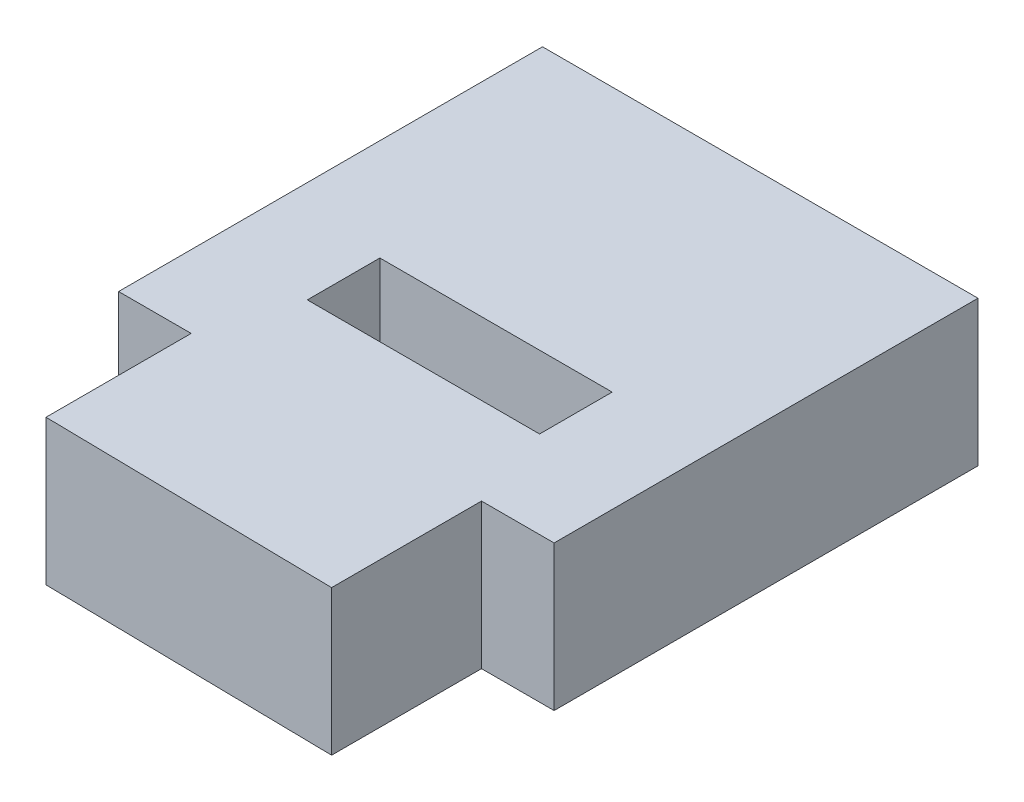
ISO-10303-21;
HEADER;
FILE_DESCRIPTION(('STEP AP214'),'2;1');
FILE_NAME('part.step','',(''),(''),'','','');
FILE_SCHEMA(('AUTOMOTIVE_DESIGN { 1 0 10303 214 1 1 1 1 }'));
ENDSEC;
DATA;
#1=APPLICATION_CONTEXT('core data for automotive mechanical design processes');
#2=APPLICATION_PROTOCOL_DEFINITION('international standard','automotive_design',2000,#1);
#3=PRODUCT_CONTEXT('',#1,'mechanical');
#4=PRODUCT('Part','Part','',(#3));
#5=PRODUCT_RELATED_PRODUCT_CATEGORY('part','',(#4));
#6=PRODUCT_DEFINITION_FORMATION('','',#4);
#7=PRODUCT_DEFINITION_CONTEXT('part definition',#1,'design');
#8=PRODUCT_DEFINITION('design','',#6,#7);
#9=PRODUCT_DEFINITION_SHAPE('','',#8);
#10=(LENGTH_UNIT() NAMED_UNIT(*) SI_UNIT(.MILLI.,.METRE.));
#11=(NAMED_UNIT(*) PLANE_ANGLE_UNIT() SI_UNIT($,.RADIAN.));
#12=(NAMED_UNIT(*) SI_UNIT($,.STERADIAN.) SOLID_ANGLE_UNIT());
#13=UNCERTAINTY_MEASURE_WITH_UNIT(LENGTH_MEASURE(1.E-05),#10,'distance_accuracy_value','');
#14=(GEOMETRIC_REPRESENTATION_CONTEXT(3) GLOBAL_UNCERTAINTY_ASSIGNED_CONTEXT((#13)) GLOBAL_UNIT_ASSIGNED_CONTEXT((#10,
#11,#12)) REPRESENTATION_CONTEXT('',''));
#15=CARTESIAN_POINT('',(0.,0.,0.));
#16=DIRECTION('',(0.,0.,1.));
#17=DIRECTION('',(1.,0.,0.));
#18=AXIS2_PLACEMENT_3D('',#15,#16,#17);
#19=CARTESIAN_POINT('',(0.,6.35,0.));
#20=DIRECTION('',(0.,-1.,0.));
#21=DIRECTION('',(0.,0.,-1.));
#22=AXIS2_PLACEMENT_3D('',#19,#20,#21);
#23=PLANE('',#22);
#24=DIRECTION('',(0.,0.,1.));
#25=VECTOR('',#24,1.);
#26=CARTESIAN_POINT('',(-9.525,6.35,9.271));
#27=LINE('',#26,#25);
#28=CARTESIAN_POINT('',(-9.525,6.35,-9.271));
#29=VERTEX_POINT('',#28);
#30=CARTESIAN_POINT('',(-9.525,6.35,9.271));
#31=VERTEX_POINT('',#30);
#32=EDGE_CURVE('E177',#29,#31,#27,.T.);
#33=ORIENTED_EDGE('',*,*,#32,.T.);
#34=DIRECTION('',(1.,0.,0.));
#35=VECTOR('',#34,1.);
#36=CARTESIAN_POINT('',(-6.35,6.35,9.271));
#37=LINE('',#36,#35);
#38=CARTESIAN_POINT('',(-6.35,6.35,9.271));
#39=VERTEX_POINT('',#38);
#40=EDGE_CURVE('E181',#31,#39,#37,.T.);
#41=ORIENTED_EDGE('',*,*,#40,.T.);
#42=DIRECTION('',(0.,0.,1.));
#43=VECTOR('',#42,1.);
#44=CARTESIAN_POINT('',(-6.35,6.35,15.621));
#45=LINE('',#44,#43);
#46=CARTESIAN_POINT('',(-6.35,6.35,15.621));
#47=VERTEX_POINT('',#46);
#48=EDGE_CURVE('E185',#39,#47,#45,.T.);
#49=ORIENTED_EDGE('',*,*,#48,.T.);
#50=DIRECTION('',(0.999866505022856,0.,0.0163392819113492));
#51=VECTOR('',#50,1.);
#52=CARTESIAN_POINT('',(6.35,6.35,15.8285365853659));
#53=LINE('',#52,#51);
#54=CARTESIAN_POINT('',(6.35,6.35,15.8285365853659));
#55=VERTEX_POINT('',#54);
#56=EDGE_CURVE('E188',#47,#55,#53,.T.);
#57=ORIENTED_EDGE('',*,*,#56,.T.);
#58=DIRECTION('',(0.,0.,-1.));
#59=VECTOR('',#58,1.);
#60=CARTESIAN_POINT('',(6.35,6.35,9.27099999999999));
#61=LINE('',#60,#59);
#62=CARTESIAN_POINT('',(6.35,6.35,9.27099999999999));
#63=VERTEX_POINT('',#62);
#64=EDGE_CURVE('E191',#55,#63,#61,.T.);
#65=ORIENTED_EDGE('',*,*,#64,.T.);
#66=DIRECTION('',(1.,0.,0.));
#67=VECTOR('',#66,1.);
#68=CARTESIAN_POINT('',(9.525,6.35,9.271));
#69=LINE('',#68,#67);
#70=CARTESIAN_POINT('',(9.525,6.35,9.271));
#71=VERTEX_POINT('',#70);
#72=EDGE_CURVE('E194',#63,#71,#69,.T.);
#73=ORIENTED_EDGE('',*,*,#72,.T.);
#74=DIRECTION('',(0.,0.,-1.));
#75=VECTOR('',#74,1.);
#76=CARTESIAN_POINT('',(9.525,6.35,-9.271));
#77=LINE('',#76,#75);
#78=CARTESIAN_POINT('',(9.525,6.35,-9.271));
#79=VERTEX_POINT('',#78);
#80=EDGE_CURVE('E197',#71,#79,#77,.T.);
#81=ORIENTED_EDGE('',*,*,#80,.T.);
#82=DIRECTION('',(-1.,0.,0.));
#83=VECTOR('',#82,1.);
#84=CARTESIAN_POINT('',(-9.525,6.35,-9.271));
#85=LINE('',#84,#83);
#86=EDGE_CURVE('E200',#79,#29,#85,.T.);
#87=ORIENTED_EDGE('',*,*,#86,.T.);
#88=EDGE_LOOP('',(#33,#41,#49,#57,#65,#73,#81,#87));
#89=FACE_BOUND('',#88,.T.);
#90=DIRECTION('',(0.,0.,-1.));
#91=VECTOR('',#90,1.);
#92=CARTESIAN_POINT('',(5.08,6.35,5.461));
#93=LINE('',#92,#91);
#94=CARTESIAN_POINT('',(5.08,6.35,5.461));
#95=VERTEX_POINT('',#94);
#96=CARTESIAN_POINT('',(5.08,6.35,2.286));
#97=VERTEX_POINT('',#96);
#98=EDGE_CURVE('E129',#95,#97,#93,.T.);
#99=ORIENTED_EDGE('',*,*,#98,.F.);
#100=DIRECTION('',(1.,0.,0.));
#101=VECTOR('',#100,1.);
#102=CARTESIAN_POINT('',(-5.08,6.35,5.461));
#103=LINE('',#102,#101);
#104=CARTESIAN_POINT('',(-5.08,6.35,5.461));
#105=VERTEX_POINT('',#104);
#106=EDGE_CURVE('E155',#105,#95,#103,.T.);
#107=ORIENTED_EDGE('',*,*,#106,.F.);
#108=DIRECTION('',(0.,0.,1.));
#109=VECTOR('',#108,1.);
#110=CARTESIAN_POINT('',(-5.08,6.35,5.461));
#111=LINE('',#110,#109);
#112=CARTESIAN_POINT('',(-5.08,6.35,2.286));
#113=VERTEX_POINT('',#112);
#114=EDGE_CURVE('E151',#113,#105,#111,.T.);
#115=ORIENTED_EDGE('',*,*,#114,.F.);
#116=DIRECTION('',(-1.,0.,0.));
#117=VECTOR('',#116,1.);
#118=CARTESIAN_POINT('',(-5.08,6.35,2.286));
#119=LINE('',#118,#117);
#120=EDGE_CURVE('E138',#97,#113,#119,.T.);
#121=ORIENTED_EDGE('',*,*,#120,.F.);
#122=EDGE_LOOP('',(#99,#107,#115,#121));
#123=FACE_BOUND('',#122,.T.);
#124=ADVANCED_FACE('F39',(#89,#123),#23,.F.);
#125=CARTESIAN_POINT('',(0.,0.,0.));
#126=DIRECTION('',(0.,-1.,0.));
#127=DIRECTION('',(0.,0.,-1.));
#128=AXIS2_PLACEMENT_3D('',#125,#126,#127);
#129=PLANE('',#128);
#130=DIRECTION('',(0.,0.,1.));
#131=VECTOR('',#130,1.);
#132=CARTESIAN_POINT('',(-9.525,0.,9.271));
#133=LINE('',#132,#131);
#134=CARTESIAN_POINT('',(-9.525,0.,-9.271));
#135=VERTEX_POINT('',#134);
#136=CARTESIAN_POINT('',(-9.525,0.,9.271));
#137=VERTEX_POINT('',#136);
#138=EDGE_CURVE('E147',#135,#137,#133,.T.);
#139=ORIENTED_EDGE('',*,*,#138,.F.);
#140=DIRECTION('',(-1.,0.,0.));
#141=VECTOR('',#140,1.);
#142=CARTESIAN_POINT('',(-9.525,0.,-9.271));
#143=LINE('',#142,#141);
#144=CARTESIAN_POINT('',(9.525,0.,-9.271));
#145=VERTEX_POINT('',#144);
#146=EDGE_CURVE('E182',#145,#135,#143,.T.);
#147=ORIENTED_EDGE('',*,*,#146,.F.);
#148=DIRECTION('',(0.,0.,-1.));
#149=VECTOR('',#148,1.);
#150=CARTESIAN_POINT('',(9.525,0.,-9.271));
#151=LINE('',#150,#149);
#152=CARTESIAN_POINT('',(9.525,0.,9.271));
#153=VERTEX_POINT('',#152);
#154=EDGE_CURVE('E222',#153,#145,#151,.T.);
#155=ORIENTED_EDGE('',*,*,#154,.F.);
#156=DIRECTION('',(1.,0.,0.));
#157=VECTOR('',#156,1.);
#158=CARTESIAN_POINT('',(9.525,0.,9.271));
#159=LINE('',#158,#157);
#160=CARTESIAN_POINT('',(6.35,0.,9.27099999999999));
#161=VERTEX_POINT('',#160);
#162=EDGE_CURVE('E219',#161,#153,#159,.T.);
#163=ORIENTED_EDGE('',*,*,#162,.F.);
#164=DIRECTION('',(0.,0.,-1.));
#165=VECTOR('',#164,1.);
#166=CARTESIAN_POINT('',(6.35,0.,9.27099999999999));
#167=LINE('',#166,#165);
#168=CARTESIAN_POINT('',(6.35,0.,15.8285365853659));
#169=VERTEX_POINT('',#168);
#170=EDGE_CURVE('E216',#169,#161,#167,.T.);
#171=ORIENTED_EDGE('',*,*,#170,.F.);
#172=DIRECTION('',(0.999866505022856,0.,0.0163392819113492));
#173=VECTOR('',#172,1.);
#174=CARTESIAN_POINT('',(6.35,0.,15.8285365853659));
#175=LINE('',#174,#173);
#176=CARTESIAN_POINT('',(-6.35,0.,15.621));
#177=VERTEX_POINT('',#176);
#178=EDGE_CURVE('E213',#177,#169,#175,.T.);
#179=ORIENTED_EDGE('',*,*,#178,.F.);
#180=DIRECTION('',(0.,0.,1.));
#181=VECTOR('',#180,1.);
#182=CARTESIAN_POINT('',(-6.35,0.,15.621));
#183=LINE('',#182,#181);
#184=CARTESIAN_POINT('',(-6.35,0.,9.271));
#185=VERTEX_POINT('',#184);
#186=EDGE_CURVE('E210',#185,#177,#183,.T.);
#187=ORIENTED_EDGE('',*,*,#186,.F.);
#188=DIRECTION('',(1.,0.,0.));
#189=VECTOR('',#188,1.);
#190=CARTESIAN_POINT('',(-6.35,0.,9.271));
#191=LINE('',#190,#189);
#192=EDGE_CURVE('E207',#137,#185,#191,.T.);
#193=ORIENTED_EDGE('',*,*,#192,.F.);
#194=EDGE_LOOP('',(#139,#147,#155,#163,#171,#179,#187,#193));
#195=FACE_BOUND('',#194,.T.);
#196=DIRECTION('',(1.,0.,0.));
#197=VECTOR('',#196,1.);
#198=CARTESIAN_POINT('',(-5.08,0.,5.461));
#199=LINE('',#198,#197);
#200=CARTESIAN_POINT('',(-5.08,0.,5.461));
#201=VERTEX_POINT('',#200);
#202=CARTESIAN_POINT('',(5.08,0.,5.461));
#203=VERTEX_POINT('',#202);
#204=EDGE_CURVE('E139',#201,#203,#199,.T.);
#205=ORIENTED_EDGE('',*,*,#204,.T.);
#206=DIRECTION('',(0.,0.,-1.));
#207=VECTOR('',#206,1.);
#208=CARTESIAN_POINT('',(5.08,0.,5.461));
#209=LINE('',#208,#207);
#210=CARTESIAN_POINT('',(5.08,0.,2.286));
#211=VERTEX_POINT('',#210);
#212=EDGE_CURVE('E63',#203,#211,#209,.T.);
#213=ORIENTED_EDGE('',*,*,#212,.T.);
#214=DIRECTION('',(-1.,0.,0.));
#215=VECTOR('',#214,1.);
#216=CARTESIAN_POINT('',(-5.08,0.,2.286));
#217=LINE('',#216,#215);
#218=CARTESIAN_POINT('',(-5.08,0.,2.286));
#219=VERTEX_POINT('',#218);
#220=EDGE_CURVE('E145',#211,#219,#217,.T.);
#221=ORIENTED_EDGE('',*,*,#220,.T.);
#222=DIRECTION('',(0.,0.,1.));
#223=VECTOR('',#222,1.);
#224=CARTESIAN_POINT('',(-5.08,0.,5.461));
#225=LINE('',#224,#223);
#226=EDGE_CURVE('E164',#219,#201,#225,.T.);
#227=ORIENTED_EDGE('',*,*,#226,.T.);
#228=EDGE_LOOP('',(#205,#213,#221,#227));
#229=FACE_BOUND('',#228,.T.);
#230=ADVANCED_FACE('F261',(#195,#229),#129,.T.);
#231=CARTESIAN_POINT('',(-9.525,6.35,9.271));
#232=DIRECTION('',(1.,0.,0.));
#233=DIRECTION('',(0.,0.,-1.));
#234=AXIS2_PLACEMENT_3D('',#231,#232,#233);
#235=PLANE('',#234);
#236=ORIENTED_EDGE('',*,*,#138,.T.);
#237=DIRECTION('',(0.,-1.,0.));
#238=VECTOR('',#237,1.);
#239=CARTESIAN_POINT('',(-9.525,6.35,9.271));
#240=LINE('',#239,#238);
#241=EDGE_CURVE('E11',#31,#137,#240,.T.);
#242=ORIENTED_EDGE('',*,*,#241,.F.);
#243=ORIENTED_EDGE('',*,*,#32,.F.);
#244=DIRECTION('',(0.,-1.,0.));
#245=VECTOR('',#244,1.);
#246=CARTESIAN_POINT('',(-9.525,6.35,-9.271));
#247=LINE('',#246,#245);
#248=EDGE_CURVE('E203',#29,#135,#247,.T.);
#249=ORIENTED_EDGE('',*,*,#248,.T.);
#250=EDGE_LOOP('',(#236,#242,#243,#249));
#251=FACE_BOUND('',#250,.T.);
#252=ADVANCED_FACE('F41',(#251),#235,.F.);
#253=CARTESIAN_POINT('',(-6.35,6.35,9.271));
#254=DIRECTION('',(0.,0.,-1.));
#255=DIRECTION('',(-1.,0.,0.));
#256=AXIS2_PLACEMENT_3D('',#253,#254,#255);
#257=PLANE('',#256);
#258=ORIENTED_EDGE('',*,*,#192,.T.);
#259=DIRECTION('',(0.,-1.,0.));
#260=VECTOR('',#259,1.);
#261=CARTESIAN_POINT('',(-6.35,6.35,9.271));
#262=LINE('',#261,#260);
#263=EDGE_CURVE('E48',#39,#185,#262,.T.);
#264=ORIENTED_EDGE('',*,*,#263,.F.);
#265=ORIENTED_EDGE('',*,*,#40,.F.);
#266=ORIENTED_EDGE('',*,*,#241,.T.);
#267=EDGE_LOOP('',(#258,#264,#265,#266));
#268=FACE_BOUND('',#267,.T.);
#269=ADVANCED_FACE('F278',(#268),#257,.F.);
#270=CARTESIAN_POINT('',(-6.35,6.35,15.621));
#271=DIRECTION('',(1.,0.,0.));
#272=DIRECTION('',(0.,0.,-1.));
#273=AXIS2_PLACEMENT_3D('',#270,#271,#272);
#274=PLANE('',#273);
#275=ORIENTED_EDGE('',*,*,#186,.T.);
#276=DIRECTION('',(0.,-1.,0.));
#277=VECTOR('',#276,1.);
#278=CARTESIAN_POINT('',(-6.35,6.35,15.621));
#279=LINE('',#278,#277);
#280=EDGE_CURVE('E246',#47,#177,#279,.T.);
#281=ORIENTED_EDGE('',*,*,#280,.F.);
#282=ORIENTED_EDGE('',*,*,#48,.F.);
#283=ORIENTED_EDGE('',*,*,#263,.T.);
#284=EDGE_LOOP('',(#275,#281,#282,#283));
#285=FACE_BOUND('',#284,.T.);
#286=ADVANCED_FACE('F255',(#285),#274,.F.);
#287=CARTESIAN_POINT('',(6.35,6.35,15.8285365853659));
#288=DIRECTION('',(0.0163392819113492,0.,-0.999866505022856));
#289=DIRECTION('',(-0.999866505022856,0.,-0.0163392819113492));
#290=AXIS2_PLACEMENT_3D('',#287,#288,#289);
#291=PLANE('',#290);
#292=ORIENTED_EDGE('',*,*,#178,.T.);
#293=DIRECTION('',(0.,-1.,0.));
#294=VECTOR('',#293,1.);
#295=CARTESIAN_POINT('',(6.35,6.35,15.8285365853659));
#296=LINE('',#295,#294);
#297=EDGE_CURVE('E242',#55,#169,#296,.T.);
#298=ORIENTED_EDGE('',*,*,#297,.F.);
#299=ORIENTED_EDGE('',*,*,#56,.F.);
#300=ORIENTED_EDGE('',*,*,#280,.T.);
#301=EDGE_LOOP('',(#292,#298,#299,#300));
#302=FACE_BOUND('',#301,.T.);
#303=ADVANCED_FACE('F267',(#302),#291,.F.);
#304=CARTESIAN_POINT('',(6.35,6.35,9.27099999999999));
#305=DIRECTION('',(-1.,0.,0.));
#306=DIRECTION('',(0.,0.,1.));
#307=AXIS2_PLACEMENT_3D('',#304,#305,#306);
#308=PLANE('',#307);
#309=ORIENTED_EDGE('',*,*,#170,.T.);
#310=DIRECTION('',(0.,-1.,0.));
#311=VECTOR('',#310,1.);
#312=CARTESIAN_POINT('',(6.35,6.35,9.27099999999999));
#313=LINE('',#312,#311);
#314=EDGE_CURVE('E238',#63,#161,#313,.T.);
#315=ORIENTED_EDGE('',*,*,#314,.F.);
#316=ORIENTED_EDGE('',*,*,#64,.F.);
#317=ORIENTED_EDGE('',*,*,#297,.T.);
#318=EDGE_LOOP('',(#309,#315,#316,#317));
#319=FACE_BOUND('',#318,.T.);
#320=ADVANCED_FACE('F271',(#319),#308,.F.);
#321=CARTESIAN_POINT('',(9.525,6.35,9.271));
#322=DIRECTION('',(0.,0.,-1.));
#323=DIRECTION('',(-1.,0.,0.));
#324=AXIS2_PLACEMENT_3D('',#321,#322,#323);
#325=PLANE('',#324);
#326=ORIENTED_EDGE('',*,*,#162,.T.);
#327=DIRECTION('',(0.,-1.,0.));
#328=VECTOR('',#327,1.);
#329=CARTESIAN_POINT('',(9.525,6.35,9.271));
#330=LINE('',#329,#328);
#331=EDGE_CURVE('E234',#71,#153,#330,.T.);
#332=ORIENTED_EDGE('',*,*,#331,.F.);
#333=ORIENTED_EDGE('',*,*,#72,.F.);
#334=ORIENTED_EDGE('',*,*,#314,.T.);
#335=EDGE_LOOP('',(#326,#332,#333,#334));
#336=FACE_BOUND('',#335,.T.);
#337=ADVANCED_FACE('F291',(#336),#325,.F.);
#338=CARTESIAN_POINT('',(9.525,6.35,-9.271));
#339=DIRECTION('',(-1.,0.,0.));
#340=DIRECTION('',(0.,0.,1.));
#341=AXIS2_PLACEMENT_3D('',#338,#339,#340);
#342=PLANE('',#341);
#343=ORIENTED_EDGE('',*,*,#154,.T.);
#344=DIRECTION('',(0.,-1.,0.));
#345=VECTOR('',#344,1.);
#346=CARTESIAN_POINT('',(9.525,6.35,-9.271));
#347=LINE('',#346,#345);
#348=EDGE_CURVE('E230',#79,#145,#347,.T.);
#349=ORIENTED_EDGE('',*,*,#348,.F.);
#350=ORIENTED_EDGE('',*,*,#80,.F.);
#351=ORIENTED_EDGE('',*,*,#331,.T.);
#352=EDGE_LOOP('',(#343,#349,#350,#351));
#353=FACE_BOUND('',#352,.T.);
#354=ADVANCED_FACE('F289',(#353),#342,.F.);
#355=CARTESIAN_POINT('',(-9.525,6.35,-9.271));
#356=DIRECTION('',(0.,0.,1.));
#357=DIRECTION('',(1.,0.,0.));
#358=AXIS2_PLACEMENT_3D('',#355,#356,#357);
#359=PLANE('',#358);
#360=ORIENTED_EDGE('',*,*,#146,.T.);
#361=ORIENTED_EDGE('',*,*,#248,.F.);
#362=ORIENTED_EDGE('',*,*,#86,.F.);
#363=ORIENTED_EDGE('',*,*,#348,.T.);
#364=EDGE_LOOP('',(#360,#361,#362,#363));
#365=FACE_BOUND('',#364,.T.);
#366=ADVANCED_FACE('F284',(#365),#359,.F.);
#367=CARTESIAN_POINT('',(5.08,6.35,5.461));
#368=DIRECTION('',(-1.,0.,0.));
#369=DIRECTION('',(0.,0.,1.));
#370=AXIS2_PLACEMENT_3D('',#367,#368,#369);
#371=PLANE('',#370);
#372=ORIENTED_EDGE('',*,*,#212,.F.);
#373=DIRECTION('',(0.,-1.,0.));
#374=VECTOR('',#373,1.);
#375=CARTESIAN_POINT('',(5.08,6.35,5.461));
#376=LINE('',#375,#374);
#377=EDGE_CURVE('E133',#95,#203,#376,.T.);
#378=ORIENTED_EDGE('',*,*,#377,.F.);
#379=ORIENTED_EDGE('',*,*,#98,.T.);
#380=DIRECTION('',(0.,-1.,0.));
#381=VECTOR('',#380,1.);
#382=CARTESIAN_POINT('',(5.08,6.35,2.286));
#383=LINE('',#382,#381);
#384=EDGE_CURVE('E132',#97,#211,#383,.T.);
#385=ORIENTED_EDGE('',*,*,#384,.T.);
#386=EDGE_LOOP('',(#372,#378,#379,#385));
#387=FACE_BOUND('',#386,.T.);
#388=ADVANCED_FACE('F131',(#387),#371,.T.);
#389=CARTESIAN_POINT('',(-5.08,6.35,2.286));
#390=DIRECTION('',(0.,0.,1.));
#391=DIRECTION('',(1.,0.,0.));
#392=AXIS2_PLACEMENT_3D('',#389,#390,#391);
#393=PLANE('',#392);
#394=ORIENTED_EDGE('',*,*,#220,.F.);
#395=ORIENTED_EDGE('',*,*,#384,.F.);
#396=ORIENTED_EDGE('',*,*,#120,.T.);
#397=DIRECTION('',(0.,-1.,0.));
#398=VECTOR('',#397,1.);
#399=CARTESIAN_POINT('',(-5.08,6.35,2.286));
#400=LINE('',#399,#398);
#401=EDGE_CURVE('E148',#113,#219,#400,.T.);
#402=ORIENTED_EDGE('',*,*,#401,.T.);
#403=EDGE_LOOP('',(#394,#395,#396,#402));
#404=FACE_BOUND('',#403,.T.);
#405=ADVANCED_FACE('F142',(#404),#393,.T.);
#406=CARTESIAN_POINT('',(-5.08,6.35,5.461));
#407=DIRECTION('',(1.,0.,0.));
#408=DIRECTION('',(0.,0.,-1.));
#409=AXIS2_PLACEMENT_3D('',#406,#407,#408);
#410=PLANE('',#409);
#411=ORIENTED_EDGE('',*,*,#226,.F.);
#412=ORIENTED_EDGE('',*,*,#401,.F.);
#413=ORIENTED_EDGE('',*,*,#114,.T.);
#414=DIRECTION('',(0.,-1.,0.));
#415=VECTOR('',#414,1.);
#416=CARTESIAN_POINT('',(-5.08,6.35,5.461));
#417=LINE('',#416,#415);
#418=EDGE_CURVE('E55',#105,#201,#417,.T.);
#419=ORIENTED_EDGE('',*,*,#418,.T.);
#420=EDGE_LOOP('',(#411,#412,#413,#419));
#421=FACE_BOUND('',#420,.T.);
#422=ADVANCED_FACE('F316',(#421),#410,.T.);
#423=CARTESIAN_POINT('',(-5.08,6.35,5.461));
#424=DIRECTION('',(0.,0.,-1.));
#425=DIRECTION('',(-1.,0.,0.));
#426=AXIS2_PLACEMENT_3D('',#423,#424,#425);
#427=PLANE('',#426);
#428=ORIENTED_EDGE('',*,*,#204,.F.);
#429=ORIENTED_EDGE('',*,*,#418,.F.);
#430=ORIENTED_EDGE('',*,*,#106,.T.);
#431=ORIENTED_EDGE('',*,*,#377,.T.);
#432=EDGE_LOOP('',(#428,#429,#430,#431));
#433=FACE_BOUND('',#432,.T.);
#434=ADVANCED_FACE('F320',(#433),#427,.T.);
#435=CLOSED_SHELL('',(#124,#230,#252,#269,#286,#303,#320,#337,#354,#366,#388,#405,#422,#434));
#436=MANIFOLD_SOLID_BREP('B2',#435);
#437=ADVANCED_BREP_SHAPE_REPRESENTATION('',(#18,#436),#14);
#438=SHAPE_DEFINITION_REPRESENTATION(#9,#437);
ENDSEC;
END-ISO-10303-21;
